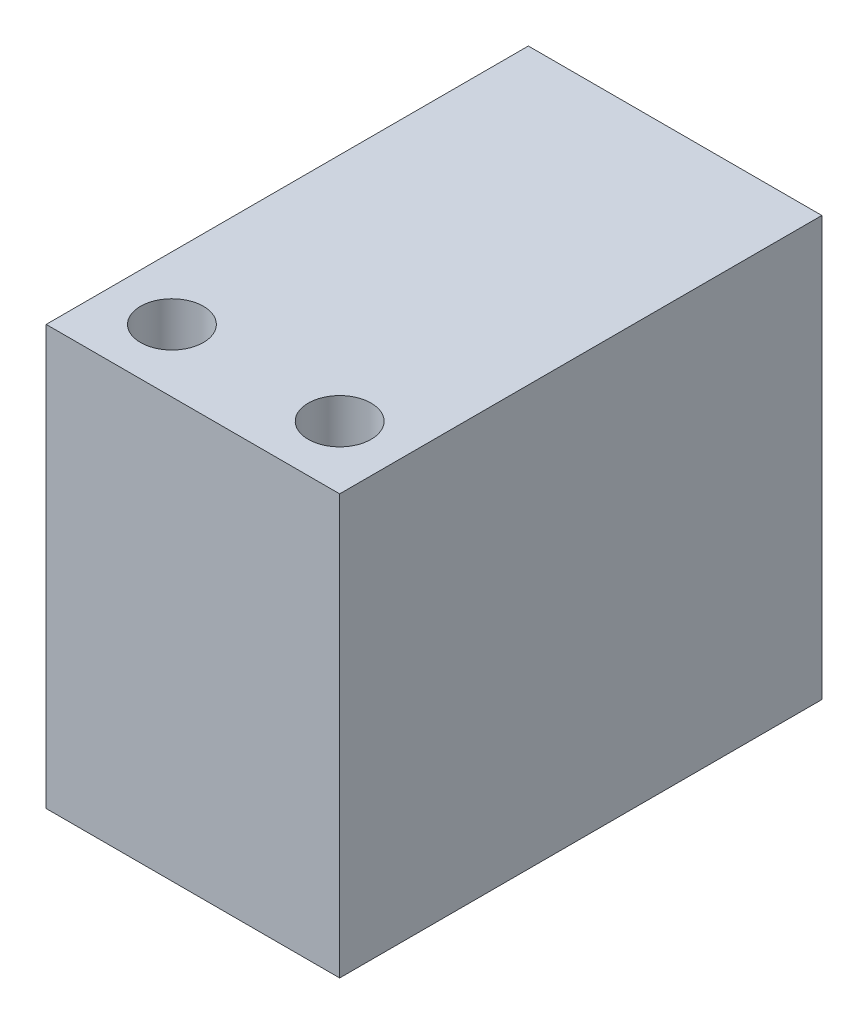
ISO-10303-21;
HEADER;
FILE_DESCRIPTION(('STEP AP214'),'2;1');
FILE_NAME('part.step','',(''),(''),'','','');
FILE_SCHEMA(('AUTOMOTIVE_DESIGN { 1 0 10303 214 1 1 1 1 }'));
ENDSEC;
DATA;
#1=APPLICATION_CONTEXT('core data for automotive mechanical design processes');
#2=APPLICATION_PROTOCOL_DEFINITION('international standard','automotive_design',2000,#1);
#3=PRODUCT_CONTEXT('',#1,'mechanical');
#4=PRODUCT('Part','Part','',(#3));
#5=PRODUCT_RELATED_PRODUCT_CATEGORY('part','',(#4));
#6=PRODUCT_DEFINITION_FORMATION('','',#4);
#7=PRODUCT_DEFINITION_CONTEXT('part definition',#1,'design');
#8=PRODUCT_DEFINITION('design','',#6,#7);
#9=PRODUCT_DEFINITION_SHAPE('','',#8);
#10=(LENGTH_UNIT() NAMED_UNIT(*) SI_UNIT(.MILLI.,.METRE.));
#11=(NAMED_UNIT(*) PLANE_ANGLE_UNIT() SI_UNIT($,.RADIAN.));
#12=(NAMED_UNIT(*) SI_UNIT($,.STERADIAN.) SOLID_ANGLE_UNIT());
#13=UNCERTAINTY_MEASURE_WITH_UNIT(LENGTH_MEASURE(1.E-05),#10,'distance_accuracy_value','');
#14=(GEOMETRIC_REPRESENTATION_CONTEXT(3) GLOBAL_UNCERTAINTY_ASSIGNED_CONTEXT((#13)) GLOBAL_UNIT_ASSIGNED_CONTEXT((#10,
#11,#12)) REPRESENTATION_CONTEXT('',''));
#15=CARTESIAN_POINT('',(0.,0.,0.));
#16=DIRECTION('',(0.,0.,1.));
#17=DIRECTION('',(1.,0.,0.));
#18=AXIS2_PLACEMENT_3D('',#15,#16,#17);
#19=CARTESIAN_POINT('',(0.,-20.,0.));
#20=DIRECTION('',(-1.,0.,0.));
#21=DIRECTION('',(0.,0.,1.));
#22=AXIS2_PLACEMENT_3D('',#19,#20,#21);
#23=PLANE('',#22);
#24=DIRECTION('',(0.,0.,1.));
#25=VECTOR('',#24,1.);
#26=CARTESIAN_POINT('',(0.,0.,0.));
#27=LINE('',#26,#25);
#28=CARTESIAN_POINT('',(0.,0.,-23.));
#29=VERTEX_POINT('',#28);
#30=CARTESIAN_POINT('',(0.,0.,0.));
#31=VERTEX_POINT('',#30);
#32=EDGE_CURVE('E131',#29,#31,#27,.T.);
#33=ORIENTED_EDGE('',*,*,#32,.F.);
#34=DIRECTION('',(0.,1.,0.));
#35=VECTOR('',#34,1.);
#36=CARTESIAN_POINT('',(0.,-20.,-23.));
#37=LINE('',#36,#35);
#38=CARTESIAN_POINT('',(0.,-20.,-23.));
#39=VERTEX_POINT('',#38);
#40=EDGE_CURVE('E11',#39,#29,#37,.T.);
#41=ORIENTED_EDGE('',*,*,#40,.F.);
#42=DIRECTION('',(0.,0.,1.));
#43=VECTOR('',#42,1.);
#44=CARTESIAN_POINT('',(0.,-20.,0.));
#45=LINE('',#44,#43);
#46=CARTESIAN_POINT('',(0.,-20.,0.));
#47=VERTEX_POINT('',#46);
#48=EDGE_CURVE('E132',#39,#47,#45,.T.);
#49=ORIENTED_EDGE('',*,*,#48,.T.);
#50=DIRECTION('',(0.,1.,0.));
#51=VECTOR('',#50,1.);
#52=CARTESIAN_POINT('',(0.,-20.,0.));
#53=LINE('',#52,#51);
#54=EDGE_CURVE('E44',#47,#31,#53,.T.);
#55=ORIENTED_EDGE('',*,*,#54,.T.);
#56=EDGE_LOOP('',(#33,#41,#49,#55));
#57=FACE_BOUND('',#56,.T.);
#58=ADVANCED_FACE('F41',(#57),#23,.T.);
#59=CARTESIAN_POINT('',(0.,-20.,-23.));
#60=DIRECTION('',(0.,0.,-1.));
#61=DIRECTION('',(-1.,0.,0.));
#62=AXIS2_PLACEMENT_3D('',#59,#60,#61);
#63=PLANE('',#62);
#64=DIRECTION('',(-1.,0.,0.));
#65=VECTOR('',#64,1.);
#66=CARTESIAN_POINT('',(0.,0.,-23.));
#67=LINE('',#66,#65);
#68=CARTESIAN_POINT('',(14.,0.,-23.));
#69=VERTEX_POINT('',#68);
#70=EDGE_CURVE('E136',#69,#29,#67,.T.);
#71=ORIENTED_EDGE('',*,*,#70,.F.);
#72=DIRECTION('',(0.,1.,0.));
#73=VECTOR('',#72,1.);
#74=CARTESIAN_POINT('',(14.,-20.,-23.));
#75=LINE('',#74,#73);
#76=CARTESIAN_POINT('',(14.,-20.,-23.));
#77=VERTEX_POINT('',#76);
#78=EDGE_CURVE('E51',#77,#69,#75,.T.);
#79=ORIENTED_EDGE('',*,*,#78,.F.);
#80=DIRECTION('',(-1.,0.,0.));
#81=VECTOR('',#80,1.);
#82=CARTESIAN_POINT('',(0.,-20.,-23.));
#83=LINE('',#82,#81);
#84=EDGE_CURVE('E142',#77,#39,#83,.T.);
#85=ORIENTED_EDGE('',*,*,#84,.T.);
#86=ORIENTED_EDGE('',*,*,#40,.T.);
#87=EDGE_LOOP('',(#71,#79,#85,#86));
#88=FACE_BOUND('',#87,.T.);
#89=ADVANCED_FACE('F167',(#88),#63,.T.);
#90=CARTESIAN_POINT('',(14.,-20.,0.));
#91=DIRECTION('',(1.,0.,0.));
#92=DIRECTION('',(0.,0.,-1.));
#93=AXIS2_PLACEMENT_3D('',#90,#91,#92);
#94=PLANE('',#93);
#95=DIRECTION('',(0.,0.,-1.));
#96=VECTOR('',#95,1.);
#97=CARTESIAN_POINT('',(14.,0.,0.));
#98=LINE('',#97,#96);
#99=CARTESIAN_POINT('',(14.,0.,0.));
#100=VERTEX_POINT('',#99);
#101=EDGE_CURVE('E152',#100,#69,#98,.T.);
#102=ORIENTED_EDGE('',*,*,#101,.F.);
#103=DIRECTION('',(0.,1.,0.));
#104=VECTOR('',#103,1.);
#105=CARTESIAN_POINT('',(14.,-20.,0.));
#106=LINE('',#105,#104);
#107=CARTESIAN_POINT('',(14.,-20.,0.));
#108=VERTEX_POINT('',#107);
#109=EDGE_CURVE('E159',#108,#100,#106,.T.);
#110=ORIENTED_EDGE('',*,*,#109,.F.);
#111=DIRECTION('',(0.,0.,-1.));
#112=VECTOR('',#111,1.);
#113=CARTESIAN_POINT('',(14.,-20.,0.));
#114=LINE('',#113,#112);
#115=EDGE_CURVE('E139',#108,#77,#114,.T.);
#116=ORIENTED_EDGE('',*,*,#115,.T.);
#117=ORIENTED_EDGE('',*,*,#78,.T.);
#118=EDGE_LOOP('',(#102,#110,#116,#117));
#119=FACE_BOUND('',#118,.T.);
#120=ADVANCED_FACE('F170',(#119),#94,.T.);
#121=CARTESIAN_POINT('',(0.,-20.,0.));
#122=DIRECTION('',(0.,0.,1.));
#123=DIRECTION('',(1.,0.,0.));
#124=AXIS2_PLACEMENT_3D('',#121,#122,#123);
#125=PLANE('',#124);
#126=DIRECTION('',(1.,0.,0.));
#127=VECTOR('',#126,1.);
#128=CARTESIAN_POINT('',(0.,0.,0.));
#129=LINE('',#128,#127);
#130=EDGE_CURVE('E148',#31,#100,#129,.T.);
#131=ORIENTED_EDGE('',*,*,#130,.F.);
#132=ORIENTED_EDGE('',*,*,#54,.F.);
#133=DIRECTION('',(1.,0.,0.));
#134=VECTOR('',#133,1.);
#135=CARTESIAN_POINT('',(0.,-20.,0.));
#136=LINE('',#135,#134);
#137=EDGE_CURVE('E135',#47,#108,#136,.T.);
#138=ORIENTED_EDGE('',*,*,#137,.T.);
#139=ORIENTED_EDGE('',*,*,#109,.T.);
#140=EDGE_LOOP('',(#131,#132,#138,#139));
#141=FACE_BOUND('',#140,.T.);
#142=ADVANCED_FACE('F164',(#141),#125,.T.);
#143=CARTESIAN_POINT('',(0.,-20.,0.));
#144=DIRECTION('',(0.,-1.,0.));
#145=DIRECTION('',(0.,0.,-1.));
#146=AXIS2_PLACEMENT_3D('',#143,#144,#145);
#147=PLANE('',#146);
#148=CARTESIAN_POINT('',(7.,-20.,-15.));
#149=DIRECTION('',(0.,-1.,0.));
#150=DIRECTION('',(0.,0.,-1.));
#151=AXIS2_PLACEMENT_3D('',#148,#149,#150);
#152=CIRCLE('',#151,4.49999999999999);
#153=CARTESIAN_POINT('',(7.,-20.,-19.5));
#154=VERTEX_POINT('',#153);
#155=EDGE_CURVE('E109',#154,#154,#152,.T.);
#156=ORIENTED_EDGE('',*,*,#155,.F.);
#157=EDGE_LOOP('',(#156));
#158=FACE_BOUND('',#157,.T.);
#159=ORIENTED_EDGE('',*,*,#48,.F.);
#160=ORIENTED_EDGE('',*,*,#84,.F.);
#161=ORIENTED_EDGE('',*,*,#115,.F.);
#162=ORIENTED_EDGE('',*,*,#137,.F.);
#163=EDGE_LOOP('',(#159,#160,#161,#162));
#164=FACE_BOUND('',#163,.T.);
#165=ADVANCED_FACE('F172',(#158,#164),#147,.T.);
#166=CARTESIAN_POINT('',(0.,0.,0.));
#167=DIRECTION('',(0.,-1.,0.));
#168=DIRECTION('',(0.,0.,-1.));
#169=AXIS2_PLACEMENT_3D('',#166,#167,#168);
#170=PLANE('',#169);
#171=CARTESIAN_POINT('',(3.,0.,-3.));
#172=DIRECTION('',(0.,1.,0.));
#173=DIRECTION('',(0.,0.,1.));
#174=AXIS2_PLACEMENT_3D('',#171,#172,#173);
#175=CIRCLE('',#174,1.5);
#176=CARTESIAN_POINT('',(3.,0.,-1.5));
#177=VERTEX_POINT('',#176);
#178=EDGE_CURVE('E108',#177,#177,#175,.T.);
#179=ORIENTED_EDGE('',*,*,#178,.F.);
#180=EDGE_LOOP('',(#179));
#181=FACE_BOUND('',#180,.T.);
#182=CARTESIAN_POINT('',(11.,0.,-3.));
#183=DIRECTION('',(0.,1.,0.));
#184=DIRECTION('',(0.,0.,1.));
#185=AXIS2_PLACEMENT_3D('',#182,#183,#184);
#186=CIRCLE('',#185,1.5);
#187=CARTESIAN_POINT('',(11.,0.,-1.5));
#188=VERTEX_POINT('',#187);
#189=EDGE_CURVE('E123',#188,#188,#186,.T.);
#190=ORIENTED_EDGE('',*,*,#189,.F.);
#191=EDGE_LOOP('',(#190));
#192=FACE_BOUND('',#191,.T.);
#193=ORIENTED_EDGE('',*,*,#32,.T.);
#194=ORIENTED_EDGE('',*,*,#130,.T.);
#195=ORIENTED_EDGE('',*,*,#101,.T.);
#196=ORIENTED_EDGE('',*,*,#70,.T.);
#197=EDGE_LOOP('',(#193,#194,#195,#196));
#198=FACE_BOUND('',#197,.T.);
#199=ADVANCED_FACE('F166',(#181,#192,#198),#170,.F.);
#200=CARTESIAN_POINT('',(11.,-5.,-3.));
#201=DIRECTION('',(0.,1.,0.));
#202=DIRECTION('',(0.,0.,1.));
#203=AXIS2_PLACEMENT_3D('',#200,#201,#202);
#204=CONICAL_SURFACE('',#203,1.5,1.02974425867665);
#205=CARTESIAN_POINT('',(11.,-5.90129092854134,-3.));
#206=VERTEX_POINT('',#205);
#207=VERTEX_LOOP('',#206);
#208=FACE_BOUND('',#207,.T.);
#209=CARTESIAN_POINT('',(11.,-5.,-3.));
#210=DIRECTION('',(0.,1.,0.));
#211=DIRECTION('',(0.,0.,1.));
#212=AXIS2_PLACEMENT_3D('',#209,#210,#211);
#213=CIRCLE('',#212,1.5);
#214=CARTESIAN_POINT('',(11.,-5.,-1.5));
#215=VERTEX_POINT('',#214);
#216=EDGE_CURVE('E127',#215,#215,#213,.T.);
#217=ORIENTED_EDGE('',*,*,#216,.T.);
#218=EDGE_LOOP('',(#217));
#219=FACE_BOUND('',#218,.T.);
#220=ADVANCED_FACE('F180',(#208,#219),#204,.F.);
#221=CARTESIAN_POINT('',(11.,0.,-3.));
#222=DIRECTION('',(0.,1.,0.));
#223=DIRECTION('',(0.,0.,1.));
#224=AXIS2_PLACEMENT_3D('',#221,#222,#223);
#225=CYLINDRICAL_SURFACE('',#224,1.5);
#226=ORIENTED_EDGE('',*,*,#216,.F.);
#227=EDGE_LOOP('',(#226));
#228=FACE_BOUND('',#227,.T.);
#229=ORIENTED_EDGE('',*,*,#189,.T.);
#230=EDGE_LOOP('',(#229));
#231=FACE_BOUND('',#230,.T.);
#232=ADVANCED_FACE('F220',(#228,#231),#225,.F.);
#233=CARTESIAN_POINT('',(3.,-5.,-3.));
#234=DIRECTION('',(0.,1.,0.));
#235=DIRECTION('',(0.,0.,1.));
#236=AXIS2_PLACEMENT_3D('',#233,#234,#235);
#237=CONICAL_SURFACE('',#236,1.5,1.02974425867665);
#238=CARTESIAN_POINT('',(3.,-5.90129092854134,-3.));
#239=VERTEX_POINT('',#238);
#240=VERTEX_LOOP('',#239);
#241=FACE_BOUND('',#240,.T.);
#242=CARTESIAN_POINT('',(3.,-5.,-3.));
#243=DIRECTION('',(0.,1.,0.));
#244=DIRECTION('',(0.,0.,1.));
#245=AXIS2_PLACEMENT_3D('',#242,#243,#244);
#246=CIRCLE('',#245,1.5);
#247=CARTESIAN_POINT('',(3.,-5.,-1.5));
#248=VERTEX_POINT('',#247);
#249=EDGE_CURVE('E115',#248,#248,#246,.T.);
#250=ORIENTED_EDGE('',*,*,#249,.T.);
#251=EDGE_LOOP('',(#250));
#252=FACE_BOUND('',#251,.T.);
#253=ADVANCED_FACE('F229',(#241,#252),#237,.F.);
#254=CARTESIAN_POINT('',(3.,0.,-3.));
#255=DIRECTION('',(0.,1.,0.));
#256=DIRECTION('',(0.,0.,1.));
#257=AXIS2_PLACEMENT_3D('',#254,#255,#256);
#258=CYLINDRICAL_SURFACE('',#257,1.5);
#259=ORIENTED_EDGE('',*,*,#249,.F.);
#260=EDGE_LOOP('',(#259));
#261=FACE_BOUND('',#260,.T.);
#262=ORIENTED_EDGE('',*,*,#178,.T.);
#263=EDGE_LOOP('',(#262));
#264=FACE_BOUND('',#263,.T.);
#265=ADVANCED_FACE('F101',(#261,#264),#258,.F.);
#266=CARTESIAN_POINT('',(7.,-8.,-15.));
#267=DIRECTION('',(0.,-1.,0.));
#268=DIRECTION('',(0.,0.,-1.));
#269=AXIS2_PLACEMENT_3D('',#266,#267,#268);
#270=CONICAL_SURFACE('',#269,4.5,1.02974425867665);
#271=CARTESIAN_POINT('',(6.99999999999999,-5.29612721437598,-15.));
#272=VERTEX_POINT('',#271);
#273=VERTEX_LOOP('',#272);
#274=FACE_BOUND('',#273,.T.);
#275=CARTESIAN_POINT('',(7.,-8.,-15.));
#276=DIRECTION('',(0.,-1.,0.));
#277=DIRECTION('',(0.,0.,-1.));
#278=AXIS2_PLACEMENT_3D('',#275,#276,#277);
#279=CIRCLE('',#278,4.5);
#280=CARTESIAN_POINT('',(7.,-8.,-19.5));
#281=VERTEX_POINT('',#280);
#282=EDGE_CURVE('E105',#281,#281,#279,.T.);
#283=ORIENTED_EDGE('',*,*,#282,.T.);
#284=EDGE_LOOP('',(#283));
#285=FACE_BOUND('',#284,.T.);
#286=ADVANCED_FACE('F97',(#274,#285),#270,.F.);
#287=CARTESIAN_POINT('',(7.,-20.,-15.));
#288=DIRECTION('',(0.,-1.,0.));
#289=DIRECTION('',(0.,0.,-1.));
#290=AXIS2_PLACEMENT_3D('',#287,#288,#289);
#291=CYLINDRICAL_SURFACE('',#290,4.49999999999999);
#292=ORIENTED_EDGE('',*,*,#282,.F.);
#293=EDGE_LOOP('',(#292));
#294=FACE_BOUND('',#293,.T.);
#295=ORIENTED_EDGE('',*,*,#155,.T.);
#296=EDGE_LOOP('',(#295));
#297=FACE_BOUND('',#296,.T.);
#298=ADVANCED_FACE('F100',(#294,#297),#291,.F.);
#299=CLOSED_SHELL('',(#58,#89,#120,#142,#165,#199,#220,#232,#253,#265,#286,#298));
#300=MANIFOLD_SOLID_BREP('B2',#299);
#301=ADVANCED_BREP_SHAPE_REPRESENTATION('',(#18,#300),#14);
#302=SHAPE_DEFINITION_REPRESENTATION(#9,#301);
ENDSEC;
END-ISO-10303-21;
